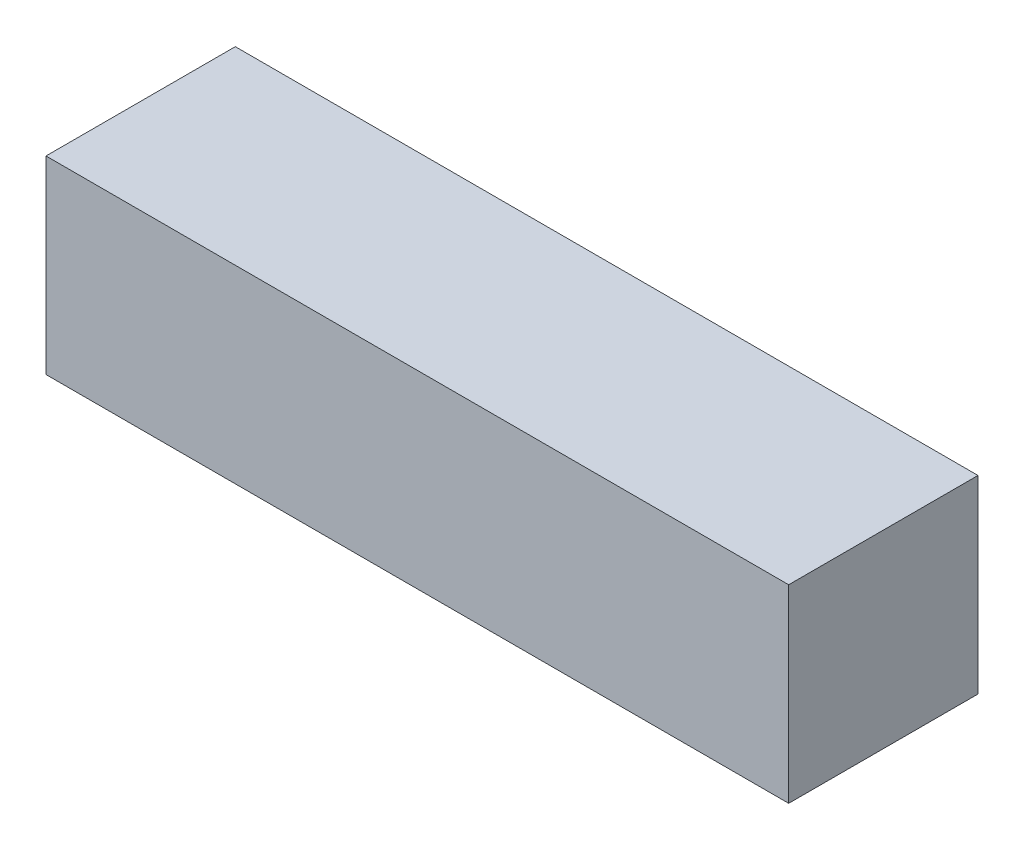
ISO-10303-21;
HEADER;
FILE_DESCRIPTION(('STEP AP214'),'2;1');
FILE_NAME('part.step','',(''),(''),'','','');
FILE_SCHEMA(('AUTOMOTIVE_DESIGN { 1 0 10303 214 1 1 1 1 }'));
ENDSEC;
DATA;
#1=APPLICATION_CONTEXT('core data for automotive mechanical design processes');
#2=APPLICATION_PROTOCOL_DEFINITION('international standard','automotive_design',2000,#1);
#3=PRODUCT_CONTEXT('',#1,'mechanical');
#4=PRODUCT('Part','Part','',(#3));
#5=PRODUCT_RELATED_PRODUCT_CATEGORY('part','',(#4));
#6=PRODUCT_DEFINITION_FORMATION('','',#4);
#7=PRODUCT_DEFINITION_CONTEXT('part definition',#1,'design');
#8=PRODUCT_DEFINITION('design','',#6,#7);
#9=PRODUCT_DEFINITION_SHAPE('','',#8);
#10=(LENGTH_UNIT() NAMED_UNIT(*) SI_UNIT(.MILLI.,.METRE.));
#11=(NAMED_UNIT(*) PLANE_ANGLE_UNIT() SI_UNIT($,.RADIAN.));
#12=(NAMED_UNIT(*) SI_UNIT($,.STERADIAN.) SOLID_ANGLE_UNIT());
#13=UNCERTAINTY_MEASURE_WITH_UNIT(LENGTH_MEASURE(1.E-05),#10,'distance_accuracy_value','');
#14=(GEOMETRIC_REPRESENTATION_CONTEXT(3) GLOBAL_UNCERTAINTY_ASSIGNED_CONTEXT((#13)) GLOBAL_UNIT_ASSIGNED_CONTEXT((#10,
#11,#12)) REPRESENTATION_CONTEXT('',''));
#15=CARTESIAN_POINT('',(0.,0.,0.));
#16=DIRECTION('',(0.,0.,1.));
#17=DIRECTION('',(1.,0.,0.));
#18=AXIS2_PLACEMENT_3D('',#15,#16,#17);
#19=CARTESIAN_POINT('',(0.,26.,0.));
#20=DIRECTION('',(1.,0.,0.));
#21=DIRECTION('',(0.,0.,-1.));
#22=AXIS2_PLACEMENT_3D('',#19,#20,#21);
#23=PLANE('',#22);
#24=DIRECTION('',(0.,0.,1.));
#25=VECTOR('',#24,1.);
#26=CARTESIAN_POINT('',(0.,0.,0.));
#27=LINE('',#26,#25);
#28=CARTESIAN_POINT('',(0.,0.,-26.));
#29=VERTEX_POINT('',#28);
#30=CARTESIAN_POINT('',(0.,0.,0.));
#31=VERTEX_POINT('',#30);
#32=EDGE_CURVE('E113',#29,#31,#27,.T.);
#33=ORIENTED_EDGE('',*,*,#32,.T.);
#34=DIRECTION('',(0.,-1.,0.));
#35=VECTOR('',#34,1.);
#36=CARTESIAN_POINT('',(0.,26.,0.));
#37=LINE('',#36,#35);
#38=CARTESIAN_POINT('',(0.,26.,0.));
#39=VERTEX_POINT('',#38);
#40=EDGE_CURVE('E11',#39,#31,#37,.T.);
#41=ORIENTED_EDGE('',*,*,#40,.F.);
#42=DIRECTION('',(0.,0.,1.));
#43=VECTOR('',#42,1.);
#44=CARTESIAN_POINT('',(0.,26.,0.));
#45=LINE('',#44,#43);
#46=CARTESIAN_POINT('',(0.,26.,-26.));
#47=VERTEX_POINT('',#46);
#48=EDGE_CURVE('E97',#47,#39,#45,.T.);
#49=ORIENTED_EDGE('',*,*,#48,.F.);
#50=DIRECTION('',(0.,-1.,0.));
#51=VECTOR('',#50,1.);
#52=CARTESIAN_POINT('',(0.,26.,-26.));
#53=LINE('',#52,#51);
#54=EDGE_CURVE('E109',#47,#29,#53,.T.);
#55=ORIENTED_EDGE('',*,*,#54,.T.);
#56=EDGE_LOOP('',(#33,#41,#49,#55));
#57=FACE_BOUND('',#56,.T.);
#58=ADVANCED_FACE('F45',(#57),#23,.F.);
#59=CARTESIAN_POINT('',(0.,26.,0.));
#60=DIRECTION('',(0.,0.,-1.));
#61=DIRECTION('',(-1.,0.,0.));
#62=AXIS2_PLACEMENT_3D('',#59,#60,#61);
#63=PLANE('',#62);
#64=DIRECTION('',(1.,0.,0.));
#65=VECTOR('',#64,1.);
#66=CARTESIAN_POINT('',(0.,0.,0.));
#67=LINE('',#66,#65);
#68=CARTESIAN_POINT('',(102.,0.,0.));
#69=VERTEX_POINT('',#68);
#70=EDGE_CURVE('E102',#31,#69,#67,.T.);
#71=ORIENTED_EDGE('',*,*,#70,.T.);
#72=DIRECTION('',(0.,-1.,0.));
#73=VECTOR('',#72,1.);
#74=CARTESIAN_POINT('',(102.,26.,0.));
#75=LINE('',#74,#73);
#76=CARTESIAN_POINT('',(102.,26.,0.));
#77=VERTEX_POINT('',#76);
#78=EDGE_CURVE('E54',#77,#69,#75,.T.);
#79=ORIENTED_EDGE('',*,*,#78,.F.);
#80=DIRECTION('',(1.,0.,0.));
#81=VECTOR('',#80,1.);
#82=CARTESIAN_POINT('',(0.,26.,0.));
#83=LINE('',#82,#81);
#84=EDGE_CURVE('E92',#39,#77,#83,.T.);
#85=ORIENTED_EDGE('',*,*,#84,.F.);
#86=ORIENTED_EDGE('',*,*,#40,.T.);
#87=EDGE_LOOP('',(#71,#79,#85,#86));
#88=FACE_BOUND('',#87,.T.);
#89=ADVANCED_FACE('F101',(#88),#63,.F.);
#90=CARTESIAN_POINT('',(102.,26.,0.));
#91=DIRECTION('',(-1.,0.,0.));
#92=DIRECTION('',(0.,0.,1.));
#93=AXIS2_PLACEMENT_3D('',#90,#91,#92);
#94=PLANE('',#93);
#95=DIRECTION('',(0.,0.,-1.));
#96=VECTOR('',#95,1.);
#97=CARTESIAN_POINT('',(102.,0.,0.));
#98=LINE('',#97,#96);
#99=CARTESIAN_POINT('',(102.,0.,-26.));
#100=VERTEX_POINT('',#99);
#101=EDGE_CURVE('E79',#69,#100,#98,.T.);
#102=ORIENTED_EDGE('',*,*,#101,.T.);
#103=DIRECTION('',(0.,-1.,0.));
#104=VECTOR('',#103,1.);
#105=CARTESIAN_POINT('',(102.,26.,-26.));
#106=LINE('',#105,#104);
#107=CARTESIAN_POINT('',(102.,26.,-26.));
#108=VERTEX_POINT('',#107);
#109=EDGE_CURVE('E104',#108,#100,#106,.T.);
#110=ORIENTED_EDGE('',*,*,#109,.F.);
#111=DIRECTION('',(0.,0.,-1.));
#112=VECTOR('',#111,1.);
#113=CARTESIAN_POINT('',(102.,26.,0.));
#114=LINE('',#113,#112);
#115=EDGE_CURVE('E95',#77,#108,#114,.T.);
#116=ORIENTED_EDGE('',*,*,#115,.F.);
#117=ORIENTED_EDGE('',*,*,#78,.T.);
#118=EDGE_LOOP('',(#102,#110,#116,#117));
#119=FACE_BOUND('',#118,.T.);
#120=ADVANCED_FACE('F105',(#119),#94,.F.);
#121=CARTESIAN_POINT('',(0.,26.,-26.));
#122=DIRECTION('',(0.,0.,1.));
#123=DIRECTION('',(1.,0.,0.));
#124=AXIS2_PLACEMENT_3D('',#121,#122,#123);
#125=PLANE('',#124);
#126=DIRECTION('',(-1.,0.,0.));
#127=VECTOR('',#126,1.);
#128=CARTESIAN_POINT('',(0.,0.,-26.));
#129=LINE('',#128,#127);
#130=EDGE_CURVE('E85',#100,#29,#129,.T.);
#131=ORIENTED_EDGE('',*,*,#130,.T.);
#132=ORIENTED_EDGE('',*,*,#54,.F.);
#133=DIRECTION('',(-1.,0.,0.));
#134=VECTOR('',#133,1.);
#135=CARTESIAN_POINT('',(0.,26.,-26.));
#136=LINE('',#135,#134);
#137=EDGE_CURVE('E62',#108,#47,#136,.T.);
#138=ORIENTED_EDGE('',*,*,#137,.F.);
#139=ORIENTED_EDGE('',*,*,#109,.T.);
#140=EDGE_LOOP('',(#131,#132,#138,#139));
#141=FACE_BOUND('',#140,.T.);
#142=ADVANCED_FACE('F126',(#141),#125,.F.);
#143=CARTESIAN_POINT('',(0.,26.,0.));
#144=DIRECTION('',(0.,-1.,0.));
#145=DIRECTION('',(0.,0.,-1.));
#146=AXIS2_PLACEMENT_3D('',#143,#144,#145);
#147=PLANE('',#146);
#148=ORIENTED_EDGE('',*,*,#48,.T.);
#149=ORIENTED_EDGE('',*,*,#84,.T.);
#150=ORIENTED_EDGE('',*,*,#115,.T.);
#151=ORIENTED_EDGE('',*,*,#137,.T.);
#152=EDGE_LOOP('',(#148,#149,#150,#151));
#153=FACE_BOUND('',#152,.T.);
#154=ADVANCED_FACE('F93',(#153),#147,.F.);
#155=CARTESIAN_POINT('',(0.,0.,0.));
#156=DIRECTION('',(0.,-1.,0.));
#157=DIRECTION('',(0.,0.,-1.));
#158=AXIS2_PLACEMENT_3D('',#155,#156,#157);
#159=PLANE('',#158);
#160=ORIENTED_EDGE('',*,*,#32,.F.);
#161=ORIENTED_EDGE('',*,*,#130,.F.);
#162=ORIENTED_EDGE('',*,*,#101,.F.);
#163=ORIENTED_EDGE('',*,*,#70,.F.);
#164=EDGE_LOOP('',(#160,#161,#162,#163));
#165=FACE_BOUND('',#164,.T.);
#166=ADVANCED_FACE('F129',(#165),#159,.T.);
#167=CLOSED_SHELL('',(#58,#89,#120,#142,#154,#166));
#168=MANIFOLD_SOLID_BREP('B2',#167);
#169=ADVANCED_BREP_SHAPE_REPRESENTATION('',(#18,#168),#14);
#170=SHAPE_DEFINITION_REPRESENTATION(#9,#169);
ENDSEC;
END-ISO-10303-21;
